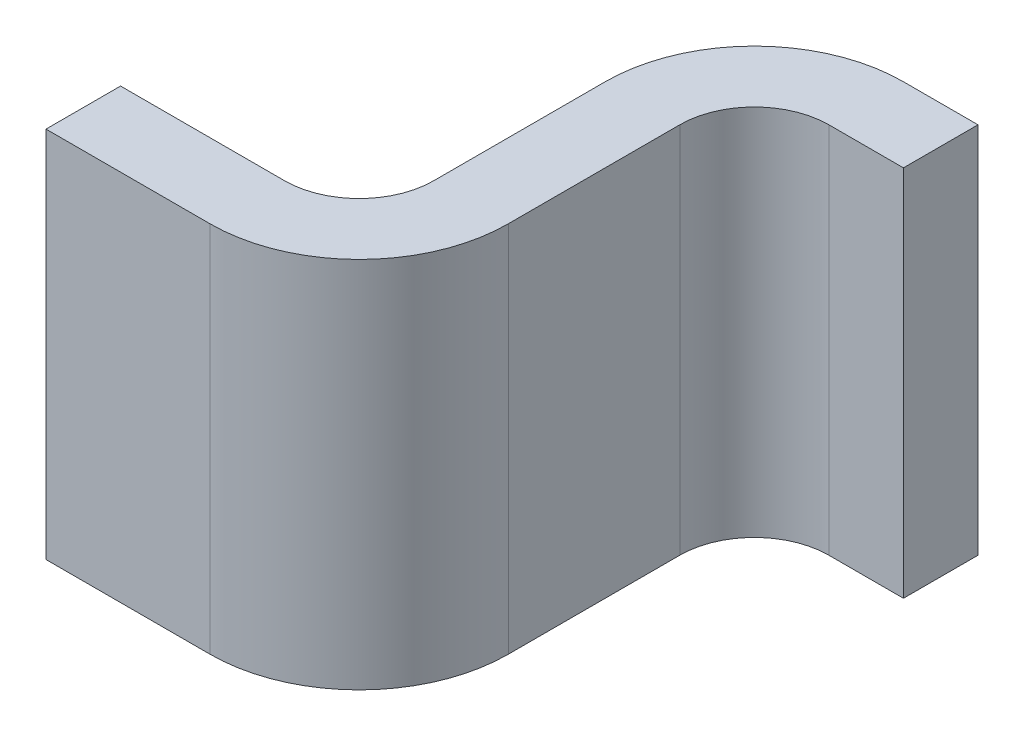
ISO-10303-21;
HEADER;
FILE_DESCRIPTION(('STEP AP214'),'2;1');
FILE_NAME('part.step','',(''),(''),'','','');
FILE_SCHEMA(('AUTOMOTIVE_DESIGN { 1 0 10303 214 1 1 1 1 }'));
ENDSEC;
DATA;
#1=APPLICATION_CONTEXT('core data for automotive mechanical design processes');
#2=APPLICATION_PROTOCOL_DEFINITION('international standard','automotive_design',2000,#1);
#3=PRODUCT_CONTEXT('',#1,'mechanical');
#4=PRODUCT('Part','Part','',(#3));
#5=PRODUCT_RELATED_PRODUCT_CATEGORY('part','',(#4));
#6=PRODUCT_DEFINITION_FORMATION('','',#4);
#7=PRODUCT_DEFINITION_CONTEXT('part definition',#1,'design');
#8=PRODUCT_DEFINITION('design','',#6,#7);
#9=PRODUCT_DEFINITION_SHAPE('','',#8);
#10=(LENGTH_UNIT() NAMED_UNIT(*) SI_UNIT(.MILLI.,.METRE.));
#11=(NAMED_UNIT(*) PLANE_ANGLE_UNIT() SI_UNIT($,.RADIAN.));
#12=(NAMED_UNIT(*) SI_UNIT($,.STERADIAN.) SOLID_ANGLE_UNIT());
#13=UNCERTAINTY_MEASURE_WITH_UNIT(LENGTH_MEASURE(1.E-05),#10,'distance_accuracy_value','');
#14=(GEOMETRIC_REPRESENTATION_CONTEXT(3) GLOBAL_UNCERTAINTY_ASSIGNED_CONTEXT((#13)) GLOBAL_UNIT_ASSIGNED_CONTEXT((#10,
#11,#12)) REPRESENTATION_CONTEXT('',''));
#15=CARTESIAN_POINT('',(0.,0.,0.));
#16=DIRECTION('',(0.,0.,1.));
#17=DIRECTION('',(1.,0.,0.));
#18=AXIS2_PLACEMENT_3D('',#15,#16,#17);
#19=CARTESIAN_POINT('',(0.,0.25,0.63));
#20=DIRECTION('',(0.,0.,-1.));
#21=DIRECTION('',(-1.,0.,0.));
#22=AXIS2_PLACEMENT_3D('',#19,#20,#21);
#23=PLANE('',#22);
#24=DIRECTION('',(1.,0.,0.));
#25=VECTOR('',#24,1.);
#26=CARTESIAN_POINT('',(0.,0.25,0.63));
#27=LINE('',#26,#25);
#28=CARTESIAN_POINT('',(0.22,0.25,0.63));
#29=VERTEX_POINT('',#28);
#30=CARTESIAN_POINT('',(0.,0.25,0.63));
#31=VERTEX_POINT('',#30);
#32=EDGE_CURVE('E191',#29,#31,#27,.F.);
#33=ORIENTED_EDGE('',*,*,#32,.T.);
#34=DIRECTION('',(0.,1.,0.));
#35=VECTOR('',#34,1.);
#36=CARTESIAN_POINT('',(0.,-0.25,0.63));
#37=LINE('',#36,#35);
#38=CARTESIAN_POINT('',(0.,-0.25,0.63));
#39=VERTEX_POINT('',#38);
#40=EDGE_CURVE('E93',#39,#31,#37,.T.);
#41=ORIENTED_EDGE('',*,*,#40,.F.);
#42=DIRECTION('',(1.,0.,0.));
#43=VECTOR('',#42,1.);
#44=CARTESIAN_POINT('',(0.,-0.25,0.63));
#45=LINE('',#44,#43);
#46=CARTESIAN_POINT('',(0.22,-0.25,0.63));
#47=VERTEX_POINT('',#46);
#48=EDGE_CURVE('E174',#39,#47,#45,.T.);
#49=ORIENTED_EDGE('',*,*,#48,.T.);
#50=DIRECTION('',(0.,1.,0.));
#51=VECTOR('',#50,1.);
#52=CARTESIAN_POINT('',(0.22,0.25,0.63));
#53=LINE('',#52,#51);
#54=EDGE_CURVE('E85',#29,#47,#53,.F.);
#55=ORIENTED_EDGE('',*,*,#54,.F.);
#56=EDGE_LOOP('',(#33,#41,#49,#55));
#57=FACE_BOUND('',#56,.T.);
#58=ADVANCED_FACE('F16',(#57),#23,.F.);
#59=CARTESIAN_POINT('',(0.,-0.25,0.53));
#60=DIRECTION('',(-1.,0.,0.));
#61=DIRECTION('',(0.,0.,1.));
#62=AXIS2_PLACEMENT_3D('',#59,#60,#61);
#63=PLANE('',#62);
#64=DIRECTION('',(0.,0.,1.));
#65=VECTOR('',#64,1.);
#66=CARTESIAN_POINT('',(0.,0.25,0.53));
#67=LINE('',#66,#65);
#68=CARTESIAN_POINT('',(0.,0.25,0.53));
#69=VERTEX_POINT('',#68);
#70=EDGE_CURVE('E181',#31,#69,#67,.F.);
#71=ORIENTED_EDGE('',*,*,#70,.T.);
#72=DIRECTION('',(0.,1.,0.));
#73=VECTOR('',#72,1.);
#74=CARTESIAN_POINT('',(0.,-0.25,0.53));
#75=LINE('',#74,#73);
#76=CARTESIAN_POINT('',(0.,-0.25,0.53));
#77=VERTEX_POINT('',#76);
#78=EDGE_CURVE('E164',#69,#77,#75,.F.);
#79=ORIENTED_EDGE('',*,*,#78,.T.);
#80=DIRECTION('',(0.,0.,1.));
#81=VECTOR('',#80,1.);
#82=CARTESIAN_POINT('',(0.,-0.25,0.63));
#83=LINE('',#82,#81);
#84=EDGE_CURVE('E176',#77,#39,#83,.T.);
#85=ORIENTED_EDGE('',*,*,#84,.T.);
#86=ORIENTED_EDGE('',*,*,#40,.T.);
#87=EDGE_LOOP('',(#71,#79,#85,#86));
#88=FACE_BOUND('',#87,.T.);
#89=ADVANCED_FACE('F226',(#88),#63,.T.);
#90=CARTESIAN_POINT('',(0.22,0.25,0.43));
#91=DIRECTION('',(0.,1.,0.));
#92=DIRECTION('',(0.,0.,1.));
#93=AXIS2_PLACEMENT_3D('',#90,#91,#92);
#94=CYLINDRICAL_SURFACE('',#93,0.2);
#95=CARTESIAN_POINT('',(0.22,0.25,0.43));
#96=DIRECTION('',(0.,1.,0.));
#97=DIRECTION('',(0.,0.,1.));
#98=AXIS2_PLACEMENT_3D('',#95,#96,#97);
#99=CIRCLE('',#98,0.2);
#100=CARTESIAN_POINT('',(0.42,0.25,0.43));
#101=VERTEX_POINT('',#100);
#102=EDGE_CURVE('E19',#29,#101,#99,.T.);
#103=ORIENTED_EDGE('',*,*,#102,.F.);
#104=ORIENTED_EDGE('',*,*,#54,.T.);
#105=CARTESIAN_POINT('',(0.22,-0.25,0.43));
#106=DIRECTION('',(0.,1.,0.));
#107=DIRECTION('',(0.,0.,1.));
#108=AXIS2_PLACEMENT_3D('',#105,#106,#107);
#109=CIRCLE('',#108,0.2);
#110=CARTESIAN_POINT('',(0.42,-0.25,0.43));
#111=VERTEX_POINT('',#110);
#112=EDGE_CURVE('E157',#111,#47,#109,.F.);
#113=ORIENTED_EDGE('',*,*,#112,.F.);
#114=DIRECTION('',(0.,1.,0.));
#115=VECTOR('',#114,1.);
#116=CARTESIAN_POINT('',(0.42,0.25,0.43));
#117=LINE('',#116,#115);
#118=EDGE_CURVE('E152',#111,#101,#117,.T.);
#119=ORIENTED_EDGE('',*,*,#118,.T.);
#120=EDGE_LOOP('',(#103,#104,#113,#119));
#121=FACE_BOUND('',#120,.T.);
#122=ADVANCED_FACE('F214',(#121),#94,.T.);
#123=CARTESIAN_POINT('',(0.52,0.25,0.1));
#124=DIRECTION('',(0.,0.,-1.));
#125=DIRECTION('',(-1.,0.,0.));
#126=AXIS2_PLACEMENT_3D('',#123,#124,#125);
#127=PLANE('',#126);
#128=DIRECTION('',(1.,0.,0.));
#129=VECTOR('',#128,1.);
#130=CARTESIAN_POINT('',(0.52,0.25,0.1));
#131=LINE('',#130,#129);
#132=CARTESIAN_POINT('',(0.62,0.25,0.1));
#133=VERTEX_POINT('',#132);
#134=CARTESIAN_POINT('',(0.52,0.25,0.1));
#135=VERTEX_POINT('',#134);
#136=EDGE_CURVE('E150',#133,#135,#131,.F.);
#137=ORIENTED_EDGE('',*,*,#136,.T.);
#138=DIRECTION('',(0.,-1.,0.));
#139=VECTOR('',#138,1.);
#140=CARTESIAN_POINT('',(0.52,0.25,0.1));
#141=LINE('',#140,#139);
#142=CARTESIAN_POINT('',(0.52,-0.25,0.1));
#143=VERTEX_POINT('',#142);
#144=EDGE_CURVE('E149',#135,#143,#141,.T.);
#145=ORIENTED_EDGE('',*,*,#144,.T.);
#146=DIRECTION('',(1.,0.,0.));
#147=VECTOR('',#146,1.);
#148=CARTESIAN_POINT('',(0.52,-0.25,0.1));
#149=LINE('',#148,#147);
#150=CARTESIAN_POINT('',(0.62,-0.25,0.1));
#151=VERTEX_POINT('',#150);
#152=EDGE_CURVE('E120',#143,#151,#149,.T.);
#153=ORIENTED_EDGE('',*,*,#152,.T.);
#154=DIRECTION('',(0.,1.,0.));
#155=VECTOR('',#154,1.);
#156=CARTESIAN_POINT('',(0.62,-0.25,0.1));
#157=LINE('',#156,#155);
#158=EDGE_CURVE('E117',#151,#133,#157,.T.);
#159=ORIENTED_EDGE('',*,*,#158,.T.);
#160=EDGE_LOOP('',(#137,#145,#153,#159));
#161=FACE_BOUND('',#160,.T.);
#162=ADVANCED_FACE('F264',(#161),#127,.F.);
#163=CARTESIAN_POINT('',(0.,-0.25,0.53));
#164=DIRECTION('',(0.,0.,1.));
#165=DIRECTION('',(1.,0.,0.));
#166=AXIS2_PLACEMENT_3D('',#163,#164,#165);
#167=PLANE('',#166);
#168=DIRECTION('',(1.,0.,0.));
#169=VECTOR('',#168,1.);
#170=CARTESIAN_POINT('',(0.,-0.25,0.53));
#171=LINE('',#170,#169);
#172=CARTESIAN_POINT('',(0.22,-0.25,0.53));
#173=VERTEX_POINT('',#172);
#174=EDGE_CURVE('E162',#77,#173,#171,.T.);
#175=ORIENTED_EDGE('',*,*,#174,.F.);
#176=ORIENTED_EDGE('',*,*,#78,.F.);
#177=DIRECTION('',(1.,0.,0.));
#178=VECTOR('',#177,1.);
#179=CARTESIAN_POINT('',(0.,0.25,0.53));
#180=LINE('',#179,#178);
#181=CARTESIAN_POINT('',(0.22,0.25,0.53));
#182=VERTEX_POINT('',#181);
#183=EDGE_CURVE('E167',#182,#69,#180,.F.);
#184=ORIENTED_EDGE('',*,*,#183,.F.);
#185=DIRECTION('',(0.,1.,0.));
#186=VECTOR('',#185,1.);
#187=CARTESIAN_POINT('',(0.22,-0.25,0.53));
#188=LINE('',#187,#186);
#189=EDGE_CURVE('E158',#182,#173,#188,.F.);
#190=ORIENTED_EDGE('',*,*,#189,.T.);
#191=EDGE_LOOP('',(#175,#176,#184,#190));
#192=FACE_BOUND('',#191,.T.);
#193=ADVANCED_FACE('F261',(#192),#167,.F.);
#194=CARTESIAN_POINT('',(0.42,0.25,0.43));
#195=DIRECTION('',(-1.,0.,0.));
#196=DIRECTION('',(0.,0.,1.));
#197=AXIS2_PLACEMENT_3D('',#194,#195,#196);
#198=PLANE('',#197);
#199=DIRECTION('',(0.,0.,-1.));
#200=VECTOR('',#199,1.);
#201=CARTESIAN_POINT('',(0.42,0.25,0.43));
#202=LINE('',#201,#200);
#203=CARTESIAN_POINT('',(0.42,0.25,0.2));
#204=VERTEX_POINT('',#203);
#205=EDGE_CURVE('E145',#204,#101,#202,.F.);
#206=ORIENTED_EDGE('',*,*,#205,.T.);
#207=ORIENTED_EDGE('',*,*,#118,.F.);
#208=DIRECTION('',(0.,0.,1.));
#209=VECTOR('',#208,1.);
#210=CARTESIAN_POINT('',(0.42,-0.25,0.43));
#211=LINE('',#210,#209);
#212=CARTESIAN_POINT('',(0.42,-0.25,0.2));
#213=VERTEX_POINT('',#212);
#214=EDGE_CURVE('E206',#111,#213,#211,.F.);
#215=ORIENTED_EDGE('',*,*,#214,.T.);
#216=DIRECTION('',(0.,-1.,0.));
#217=VECTOR('',#216,1.);
#218=CARTESIAN_POINT('',(0.42,0.25,0.2));
#219=LINE('',#218,#217);
#220=EDGE_CURVE('E119',#213,#204,#219,.F.);
#221=ORIENTED_EDGE('',*,*,#220,.T.);
#222=EDGE_LOOP('',(#206,#207,#215,#221));
#223=FACE_BOUND('',#222,.T.);
#224=ADVANCED_FACE('F216',(#223),#198,.F.);
#225=CARTESIAN_POINT('',(0.62,-0.25,0.));
#226=DIRECTION('',(-1.,0.,0.));
#227=DIRECTION('',(0.,0.,1.));
#228=AXIS2_PLACEMENT_3D('',#225,#226,#227);
#229=PLANE('',#228);
#230=DIRECTION('',(0.,0.,1.));
#231=VECTOR('',#230,1.);
#232=CARTESIAN_POINT('',(0.62,0.25,0.));
#233=LINE('',#232,#231);
#234=CARTESIAN_POINT('',(0.62,0.25,0.));
#235=VERTEX_POINT('',#234);
#236=EDGE_CURVE('E141',#133,#235,#233,.F.);
#237=ORIENTED_EDGE('',*,*,#236,.F.);
#238=ORIENTED_EDGE('',*,*,#158,.F.);
#239=DIRECTION('',(0.,0.,1.));
#240=VECTOR('',#239,1.);
#241=CARTESIAN_POINT('',(0.62,-0.25,0.1));
#242=LINE('',#241,#240);
#243=CARTESIAN_POINT('',(0.62,-0.25,0.));
#244=VERTEX_POINT('',#243);
#245=EDGE_CURVE('E110',#151,#244,#242,.F.);
#246=ORIENTED_EDGE('',*,*,#245,.T.);
#247=DIRECTION('',(0.,1.,0.));
#248=VECTOR('',#247,1.);
#249=CARTESIAN_POINT('',(0.62,-0.25,0.));
#250=LINE('',#249,#248);
#251=EDGE_CURVE('E115',#244,#235,#250,.T.);
#252=ORIENTED_EDGE('',*,*,#251,.T.);
#253=EDGE_LOOP('',(#237,#238,#246,#252));
#254=FACE_BOUND('',#253,.T.);
#255=ADVANCED_FACE('F113',(#254),#229,.F.);
#256=CARTESIAN_POINT('',(0.52,0.25,0.2));
#257=DIRECTION('',(0.,-1.,0.));
#258=DIRECTION('',(0.,0.,-1.));
#259=AXIS2_PLACEMENT_3D('',#256,#257,#258);
#260=CYLINDRICAL_SURFACE('',#259,0.1);
#261=CARTESIAN_POINT('',(0.52,0.25,0.2));
#262=DIRECTION('',(0.,-1.,0.));
#263=DIRECTION('',(0.,0.,-1.));
#264=AXIS2_PLACEMENT_3D('',#261,#262,#263);
#265=CIRCLE('',#264,0.1);
#266=EDGE_CURVE('E203',#204,#135,#265,.T.);
#267=ORIENTED_EDGE('',*,*,#266,.F.);
#268=ORIENTED_EDGE('',*,*,#220,.F.);
#269=CARTESIAN_POINT('',(0.52,-0.25,0.2));
#270=DIRECTION('',(0.,-1.,0.));
#271=DIRECTION('',(0.,0.,-1.));
#272=AXIS2_PLACEMENT_3D('',#269,#270,#271);
#273=CIRCLE('',#272,0.1);
#274=EDGE_CURVE('E132',#143,#213,#273,.F.);
#275=ORIENTED_EDGE('',*,*,#274,.F.);
#276=ORIENTED_EDGE('',*,*,#144,.F.);
#277=EDGE_LOOP('',(#267,#268,#275,#276));
#278=FACE_BOUND('',#277,.T.);
#279=ADVANCED_FACE('F252',(#278),#260,.F.);
#280=CARTESIAN_POINT('',(0.22,-0.25,0.43));
#281=DIRECTION('',(0.,1.,0.));
#282=DIRECTION('',(0.,0.,1.));
#283=AXIS2_PLACEMENT_3D('',#280,#281,#282);
#284=CYLINDRICAL_SURFACE('',#283,0.1);
#285=CARTESIAN_POINT('',(0.22,-0.25,0.43));
#286=DIRECTION('',(0.,1.,0.));
#287=DIRECTION('',(0.,0.,1.));
#288=AXIS2_PLACEMENT_3D('',#285,#286,#287);
#289=CIRCLE('',#288,0.1);
#290=CARTESIAN_POINT('',(0.32,-0.25,0.43));
#291=VERTEX_POINT('',#290);
#292=EDGE_CURVE('E161',#173,#291,#289,.T.);
#293=ORIENTED_EDGE('',*,*,#292,.F.);
#294=ORIENTED_EDGE('',*,*,#189,.F.);
#295=CARTESIAN_POINT('',(0.22,0.25,0.43));
#296=DIRECTION('',(0.,1.,0.));
#297=DIRECTION('',(0.,0.,1.));
#298=AXIS2_PLACEMENT_3D('',#295,#296,#297);
#299=CIRCLE('',#298,0.1);
#300=CARTESIAN_POINT('',(0.32,0.25,0.43));
#301=VERTEX_POINT('',#300);
#302=EDGE_CURVE('E148',#301,#182,#299,.F.);
#303=ORIENTED_EDGE('',*,*,#302,.F.);
#304=DIRECTION('',(0.,1.,0.));
#305=VECTOR('',#304,1.);
#306=CARTESIAN_POINT('',(0.32,-0.25,0.43));
#307=LINE('',#306,#305);
#308=EDGE_CURVE('E367',#301,#291,#307,.F.);
#309=ORIENTED_EDGE('',*,*,#308,.T.);
#310=EDGE_LOOP('',(#293,#294,#303,#309));
#311=FACE_BOUND('',#310,.T.);
#312=ADVANCED_FACE('F249',(#311),#284,.F.);
#313=CARTESIAN_POINT('',(0.413933982822,0.25,0.09393398282202));
#314=DIRECTION('',(0.,1.,0.));
#315=DIRECTION('',(0.,0.,1.));
#316=AXIS2_PLACEMENT_3D('',#313,#314,#315);
#317=PLANE('',#316);
#318=CARTESIAN_POINT('',(0.52,0.25,0.2));
#319=DIRECTION('',(0.,-1.,0.));
#320=DIRECTION('',(0.,0.,-1.));
#321=AXIS2_PLACEMENT_3D('',#318,#319,#320);
#322=CIRCLE('',#321,0.2);
#323=CARTESIAN_POINT('',(0.32,0.25,0.2));
#324=VERTEX_POINT('',#323);
#325=CARTESIAN_POINT('',(0.52,0.25,0.));
#326=VERTEX_POINT('',#325);
#327=EDGE_CURVE('E200',#324,#326,#322,.T.);
#328=ORIENTED_EDGE('',*,*,#327,.F.);
#329=DIRECTION('',(0.,0.,-1.));
#330=VECTOR('',#329,1.);
#331=CARTESIAN_POINT('',(0.32,0.25,0.43));
#332=LINE('',#331,#330);
#333=EDGE_CURVE('E134',#324,#301,#332,.F.);
#334=ORIENTED_EDGE('',*,*,#333,.T.);
#335=ORIENTED_EDGE('',*,*,#302,.T.);
#336=ORIENTED_EDGE('',*,*,#183,.T.);
#337=ORIENTED_EDGE('',*,*,#70,.F.);
#338=ORIENTED_EDGE('',*,*,#32,.F.);
#339=ORIENTED_EDGE('',*,*,#102,.T.);
#340=ORIENTED_EDGE('',*,*,#205,.F.);
#341=ORIENTED_EDGE('',*,*,#266,.T.);
#342=ORIENTED_EDGE('',*,*,#136,.F.);
#343=ORIENTED_EDGE('',*,*,#236,.T.);
#344=DIRECTION('',(1.,0.,0.));
#345=VECTOR('',#344,1.);
#346=CARTESIAN_POINT('',(0.52,0.25,0.));
#347=LINE('',#346,#345);
#348=EDGE_CURVE('E129',#235,#326,#347,.F.);
#349=ORIENTED_EDGE('',*,*,#348,.T.);
#350=EDGE_LOOP('',(#328,#334,#335,#336,#337,#338,#339,#340,#341,#342,#343,#349));
#351=FACE_BOUND('',#350,.T.);
#352=ADVANCED_FACE('F223',(#351),#317,.T.);
#353=CARTESIAN_POINT('',(0.52,-0.25,0.));
#354=DIRECTION('',(0.,0.,1.));
#355=DIRECTION('',(1.,0.,0.));
#356=AXIS2_PLACEMENT_3D('',#353,#354,#355);
#357=PLANE('',#356);
#358=DIRECTION('',(1.,0.,0.));
#359=VECTOR('',#358,1.);
#360=CARTESIAN_POINT('',(0.52,-0.25,0.));
#361=LINE('',#360,#359);
#362=CARTESIAN_POINT('',(0.52,-0.25,0.));
#363=VERTEX_POINT('',#362);
#364=EDGE_CURVE('E122',#363,#244,#361,.T.);
#365=ORIENTED_EDGE('',*,*,#364,.F.);
#366=DIRECTION('',(0.,-1.,0.));
#367=VECTOR('',#366,1.);
#368=CARTESIAN_POINT('',(0.52,-0.25,0.));
#369=LINE('',#368,#367);
#370=EDGE_CURVE('E199',#326,#363,#369,.T.);
#371=ORIENTED_EDGE('',*,*,#370,.F.);
#372=ORIENTED_EDGE('',*,*,#348,.F.);
#373=ORIENTED_EDGE('',*,*,#251,.F.);
#374=EDGE_LOOP('',(#365,#371,#372,#373));
#375=FACE_BOUND('',#374,.T.);
#376=ADVANCED_FACE('F131',(#375),#357,.F.);
#377=CARTESIAN_POINT('',(0.413933982822,-0.25,0.09393398282202));
#378=DIRECTION('',(0.,-1.,0.));
#379=DIRECTION('',(0.,0.,-1.));
#380=AXIS2_PLACEMENT_3D('',#377,#378,#379);
#381=PLANE('',#380);
#382=ORIENTED_EDGE('',*,*,#274,.T.);
#383=ORIENTED_EDGE('',*,*,#214,.F.);
#384=ORIENTED_EDGE('',*,*,#112,.T.);
#385=ORIENTED_EDGE('',*,*,#48,.F.);
#386=ORIENTED_EDGE('',*,*,#84,.F.);
#387=ORIENTED_EDGE('',*,*,#174,.T.);
#388=ORIENTED_EDGE('',*,*,#292,.T.);
#389=DIRECTION('',(0.,0.,-1.));
#390=VECTOR('',#389,1.);
#391=CARTESIAN_POINT('',(0.32,-0.25,0.43));
#392=LINE('',#391,#390);
#393=CARTESIAN_POINT('',(0.32,-0.25,0.2));
#394=VERTEX_POINT('',#393);
#395=EDGE_CURVE('E34',#291,#394,#392,.T.);
#396=ORIENTED_EDGE('',*,*,#395,.T.);
#397=CARTESIAN_POINT('',(0.52,-0.25,0.2));
#398=DIRECTION('',(0.,-1.,0.));
#399=DIRECTION('',(0.,0.,-1.));
#400=AXIS2_PLACEMENT_3D('',#397,#398,#399);
#401=CIRCLE('',#400,0.2);
#402=EDGE_CURVE('E25',#363,#394,#401,.F.);
#403=ORIENTED_EDGE('',*,*,#402,.F.);
#404=ORIENTED_EDGE('',*,*,#364,.T.);
#405=ORIENTED_EDGE('',*,*,#245,.F.);
#406=ORIENTED_EDGE('',*,*,#152,.F.);
#407=EDGE_LOOP('',(#382,#383,#384,#385,#386,#387,#388,#396,#403,#404,#405,#406));
#408=FACE_BOUND('',#407,.T.);
#409=ADVANCED_FACE('F124',(#408),#381,.T.);
#410=CARTESIAN_POINT('',(0.32,-0.25,0.43));
#411=DIRECTION('',(1.,0.,0.));
#412=DIRECTION('',(0.,0.,-1.));
#413=AXIS2_PLACEMENT_3D('',#410,#411,#412);
#414=PLANE('',#413);
#415=ORIENTED_EDGE('',*,*,#395,.F.);
#416=ORIENTED_EDGE('',*,*,#308,.F.);
#417=ORIENTED_EDGE('',*,*,#333,.F.);
#418=DIRECTION('',(0.,-1.,0.));
#419=VECTOR('',#418,1.);
#420=CARTESIAN_POINT('',(0.32,-0.25,0.2));
#421=LINE('',#420,#419);
#422=EDGE_CURVE('E11',#394,#324,#421,.F.);
#423=ORIENTED_EDGE('',*,*,#422,.F.);
#424=EDGE_LOOP('',(#415,#416,#417,#423));
#425=FACE_BOUND('',#424,.T.);
#426=ADVANCED_FACE('F234',(#425),#414,.F.);
#427=CARTESIAN_POINT('',(0.52,-0.25,0.2));
#428=DIRECTION('',(0.,-1.,0.));
#429=DIRECTION('',(0.,0.,-1.));
#430=AXIS2_PLACEMENT_3D('',#427,#428,#429);
#431=CYLINDRICAL_SURFACE('',#430,0.2);
#432=ORIENTED_EDGE('',*,*,#402,.T.);
#433=ORIENTED_EDGE('',*,*,#422,.T.);
#434=ORIENTED_EDGE('',*,*,#327,.T.);
#435=ORIENTED_EDGE('',*,*,#370,.T.);
#436=EDGE_LOOP('',(#432,#433,#434,#435));
#437=FACE_BOUND('',#436,.T.);
#438=ADVANCED_FACE('F232',(#437),#431,.T.);
#439=CLOSED_SHELL('',(#58,#89,#122,#162,#193,#224,#255,#279,#312,#352,#376,#409,#426,#438));
#440=MANIFOLD_SOLID_BREP('B1',#439);
#441=ADVANCED_BREP_SHAPE_REPRESENTATION('',(#18,#440),#14);
#442=SHAPE_DEFINITION_REPRESENTATION(#9,#441);
ENDSEC;
END-ISO-10303-21;
